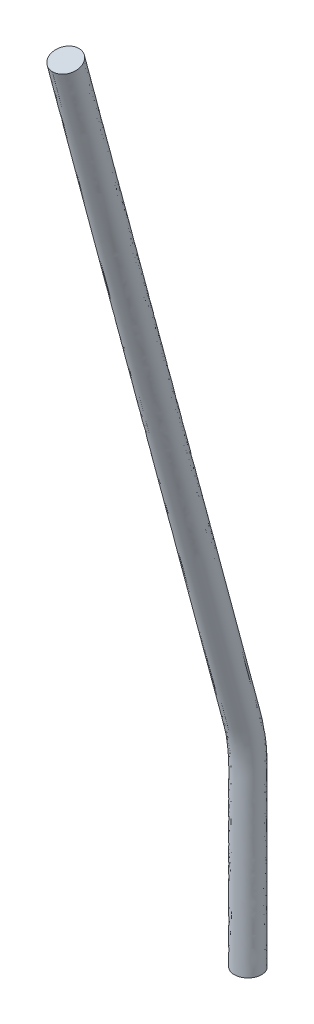
ISO-10303-21;
HEADER;
FILE_DESCRIPTION(('STEP AP214'),'2;1');
FILE_NAME('part.step','',(''),(''),'','','');
FILE_SCHEMA(('AUTOMOTIVE_DESIGN { 1 0 10303 214 1 1 1 1 }'));
ENDSEC;
DATA;
#1=APPLICATION_CONTEXT('core data for automotive mechanical design processes');
#2=APPLICATION_PROTOCOL_DEFINITION('international standard','automotive_design',2000,#1);
#3=PRODUCT_CONTEXT('',#1,'mechanical');
#4=PRODUCT('Part','Part','',(#3));
#5=PRODUCT_RELATED_PRODUCT_CATEGORY('part','',(#4));
#6=PRODUCT_DEFINITION_FORMATION('','',#4);
#7=PRODUCT_DEFINITION_CONTEXT('part definition',#1,'design');
#8=PRODUCT_DEFINITION('design','',#6,#7);
#9=PRODUCT_DEFINITION_SHAPE('','',#8);
#10=(LENGTH_UNIT() NAMED_UNIT(*) SI_UNIT(.MILLI.,.METRE.));
#11=(NAMED_UNIT(*) PLANE_ANGLE_UNIT() SI_UNIT($,.RADIAN.));
#12=(NAMED_UNIT(*) SI_UNIT($,.STERADIAN.) SOLID_ANGLE_UNIT());
#13=UNCERTAINTY_MEASURE_WITH_UNIT(LENGTH_MEASURE(1.E-05),#10,'distance_accuracy_value','');
#14=(GEOMETRIC_REPRESENTATION_CONTEXT(3) GLOBAL_UNCERTAINTY_ASSIGNED_CONTEXT((#13)) GLOBAL_UNIT_ASSIGNED_CONTEXT((#10,
#11,#12)) REPRESENTATION_CONTEXT('',''));
#15=CARTESIAN_POINT('',(0.,0.,0.));
#16=DIRECTION('',(0.,0.,1.));
#17=DIRECTION('',(1.,0.,0.));
#18=AXIS2_PLACEMENT_3D('',#15,#16,#17);
#19=CARTESIAN_POINT('',(0.,4.44089209850063E-13,0.450000000000061));
#20=DIRECTION('',(0.,1.,0.));
#21=DIRECTION('',(0.,0.,1.));
#22=AXIS2_PLACEMENT_3D('',#19,#20,#21);
#23=PLANE('',#22);
#24=CARTESIAN_POINT('',(0.,4.44089209850063E-13,0.450000000000061));
#25=DIRECTION('',(0.,1.,0.));
#26=DIRECTION('',(0.,0.,1.));
#27=AXIS2_PLACEMENT_3D('',#24,#25,#26);
#28=CIRCLE('',#27,20.);
#29=CARTESIAN_POINT('',(0.,4.47419878923938E-13,20.4500000000001));
#30=VERTEX_POINT('',#29);
#31=EDGE_CURVE('E37',#30,#30,#28,.T.);
#32=ORIENTED_EDGE('',*,*,#31,.F.);
#33=EDGE_LOOP('',(#32));
#34=FACE_BOUND('',#33,.T.);
#35=ADVANCED_FACE('F31',(#34),#23,.F.);
#36=CARTESIAN_POINT('',(0.,1282.58353142975,267.113851051514));
#37=DIRECTION('',(0.,0.965925826289082,0.25881904510247));
#38=DIRECTION('',(0.,-0.25881904510247,0.965925826289082));
#39=AXIS2_PLACEMENT_3D('',#36,#37,#38);
#40=PLANE('',#39);
#41=CARTESIAN_POINT('',(0.,1282.58353142975,267.113851051514));
#42=DIRECTION('',(0.,0.965925826289082,0.25881904510247));
#43=DIRECTION('',(0.,-0.25881904510247,0.965925826289082));
#44=AXIS2_PLACEMENT_3D('',#41,#42,#43);
#45=CIRCLE('',#44,20.);
#46=CARTESIAN_POINT('',(0.,1277.4071505277,286.432367577295));
#47=VERTEX_POINT('',#46);
#48=EDGE_CURVE('E10',#47,#47,#45,.T.);
#49=ORIENTED_EDGE('',*,*,#48,.T.);
#50=EDGE_LOOP('',(#49));
#51=FACE_BOUND('',#50,.T.);
#52=ADVANCED_FACE('F46',(#51),#40,.T.);
#53=CARTESIAN_POINT('',(0.,4.44089209850063E-13,20.45));
#54=CARTESIAN_POINT('',(0.,42.3333333251512,20.45));
#55=CARTESIAN_POINT('',(0.,84.6666666698091,20.45));
#56=CARTESIAN_POINT('',(0.,148.166666665096,20.45));
#57=CARTESIAN_POINT('',(0.,169.333333332942,20.45));
#58=CARTESIAN_POINT('',(0.,201.08333333353,20.45));
#59=CARTESIAN_POINT('',(0.,211.666666667646,20.45));
#60=CARTESIAN_POINT('',(0.,227.541666666178,20.45));
#61=CARTESIAN_POINT('',(0.,232.833333333823,20.45));
#62=CARTESIAN_POINT('',(0.,240.770833333089,20.45));
#63=CARTESIAN_POINT('',(0.,243.416666666912,20.45));
#64=CARTESIAN_POINT('',(0.,247.385416666545,20.45));
#65=CARTESIAN_POINT('',(0.,248.708333333456,20.45));
#66=CARTESIAN_POINT('',(0.,250.692708333273,20.45));
#67=CARTESIAN_POINT('',(0.,251.354166666728,20.45));
#68=CARTESIAN_POINT('',(0.,252.346354166637,20.45));
#69=CARTESIAN_POINT('',(0.,252.677083333328,20.45));
#70=CARTESIAN_POINT('',(0.,253.338541666673,20.45));
#71=CARTESIAN_POINT('',(0.,253.68231477618,20.4499997002845));
#72=CARTESIAN_POINT('',(0.,254.332089796174,20.4500003133053));
#73=CARTESIAN_POINT('',(0.,254.636908435247,20.4506513380733));
#74=CARTESIAN_POINT('',(0.,255.273810518115,20.4532566711152));
#75=CARTESIAN_POINT('',(0.,255.592258577074,20.4552106660872));
#76=CARTESIAN_POINT('',(0.,256.547586007731,20.4630265779422));
#77=CARTESIAN_POINT('',(0.,257.184448637491,20.4708424318978));
#78=CARTESIAN_POINT('',(0.,259.094906972576,20.5021049059399));
#79=CARTESIAN_POINT('',(0.,260.368373193236,20.5333666042336));
#80=CARTESIAN_POINT('',(0.,264.187750514645,20.6583993702841));
#81=CARTESIAN_POINT('',(0.,266.732641010395,20.7834208838223));
#82=CARTESIAN_POINT('',(0.,274.359169005351,21.283287183115));
#83=CARTESIAN_POINT('',(0.,279.432662975103,21.7829798576069));
#84=CARTESIAN_POINT('',(0.,289.536121411057,23.113125394701));
#85=CARTESIAN_POINT('',(0.,294.566070247085,23.9435761997898));
#86=CARTESIAN_POINT('',(0.,302.062105520137,25.434633125123));
#87=CARTESIAN_POINT('',(0.,304.552638924694,25.972537744131));
#88=CARTESIAN_POINT('',(0.,308.274234979802,26.8402929576237));
#89=CARTESIAN_POINT('',(0.,309.512400014169,27.1396937870391));
#90=CARTESIAN_POINT('',(0.,311.365852384268,27.6039595579431));
#91=CARTESIAN_POINT('',(0.,311.983037337882,27.7612422005129));
#92=CARTESIAN_POINT('',(0.,312.907835682493,28.0009495426749));
#93=CARTESIAN_POINT('',(0.,313.215938618173,28.0814825510158));
#94=CARTESIAN_POINT('',(0.,313.831813098511,28.2438083814847));
#95=CARTESIAN_POINT('',(0.,314.126413789211,28.3220724085426));
#96=CARTESIAN_POINT('',(0.,314.748288605588,28.4887026317708));
#97=CARTESIAN_POINT('',(0.,315.074115042836,28.5760078693942));
#98=CARTESIAN_POINT('',(0.,315.701042101764,28.7439924685393));
#99=CARTESIAN_POINT('',(0.,316.01450563124,28.8279847681226));
#100=CARTESIAN_POINT('',(0.,316.954896219686,29.0799616668672));
#101=CARTESIAN_POINT('',(0.,317.581823278565,29.2479462659978));
#102=CARTESIAN_POINT('',(0.,319.462604455565,29.7519000635409));
#103=CARTESIAN_POINT('',(0.,320.716458573397,30.0878692618023));
#104=CARTESIAN_POINT('',(0.,324.478020926964,31.0957768567805));
#105=CARTESIAN_POINT('',(0.,326.985729162822,31.7677152534227));
#106=CARTESIAN_POINT('',(0.,334.508853870233,33.7835304432366));
#107=CARTESIAN_POINT('',(0.,339.524270341766,35.1274072365439));
#108=CARTESIAN_POINT('',(0.,354.570519756588,39.1590376163879));
#109=CARTESIAN_POINT('',(0.,364.60135270023,41.8467912028584));
#110=CARTESIAN_POINT('',(0.,394.693851528143,49.9100519625463));
#111=CARTESIAN_POINT('',(0.,414.755517415427,55.2855591354873));
#112=CARTESIAN_POINT('',(0.,474.940515074713,71.4120806548632));
#113=CARTESIAN_POINT('',(0.,515.063846846977,82.1630950013218));
#114=CARTESIAN_POINT('',(0.,635.433842165548,114.416138038344));
#115=CARTESIAN_POINT('',(0.,715.680505710073,135.918166731261));
#116=CARTESIAN_POINT('',(0.,956.420496347217,200.424252808765));
#117=CARTESIAN_POINT('',(0.,1116.91382346394,243.428310185375));
#118=CARTESIAN_POINT('',(0.,1277.4071505277,286.432367577295));
#119=CARTESIAN_POINT('',(40.,4.44089209850063E-13,20.45));
#120=CARTESIAN_POINT('',(40.,42.3333333251512,20.45));
#121=CARTESIAN_POINT('',(40.,84.6666666698091,20.45));
#122=CARTESIAN_POINT('',(40.,148.166666665096,20.45));
#123=CARTESIAN_POINT('',(40.,169.333333332942,20.45));
#124=CARTESIAN_POINT('',(40.,201.08333333353,20.45));
#125=CARTESIAN_POINT('',(40.,211.666666667646,20.45));
#126=CARTESIAN_POINT('',(40.,227.541666666178,20.45));
#127=CARTESIAN_POINT('',(40.,232.833333333823,20.45));
#128=CARTESIAN_POINT('',(40.,240.770833333089,20.45));
#129=CARTESIAN_POINT('',(40.,243.416666666912,20.45));
#130=CARTESIAN_POINT('',(40.,247.385416666545,20.45));
#131=CARTESIAN_POINT('',(40.,248.708333333456,20.45));
#132=CARTESIAN_POINT('',(40.,250.692708333273,20.45));
#133=CARTESIAN_POINT('',(40.,251.354166666728,20.45));
#134=CARTESIAN_POINT('',(40.,252.346354166637,20.45));
#135=CARTESIAN_POINT('',(40.,252.677083333328,20.45));
#136=CARTESIAN_POINT('',(40.,253.338541666673,20.45));
#137=CARTESIAN_POINT('',(40.,253.68231477618,20.4499997002845));
#138=CARTESIAN_POINT('',(40.,254.332089796174,20.4500003133053));
#139=CARTESIAN_POINT('',(40.,254.636908435247,20.4506513380733));
#140=CARTESIAN_POINT('',(40.,255.273810518115,20.4532566711152));
#141=CARTESIAN_POINT('',(40.,255.592258577074,20.4552106660872));
#142=CARTESIAN_POINT('',(40.,256.547586007731,20.4630265779422));
#143=CARTESIAN_POINT('',(40.,257.184448637491,20.4708424318978));
#144=CARTESIAN_POINT('',(40.,259.094906972576,20.5021049059399));
#145=CARTESIAN_POINT('',(40.,260.368373193236,20.5333666042336));
#146=CARTESIAN_POINT('',(40.,264.187750514645,20.6583993702841));
#147=CARTESIAN_POINT('',(40.,266.732641010395,20.7834208838223));
#148=CARTESIAN_POINT('',(40.,274.359169005351,21.283287183115));
#149=CARTESIAN_POINT('',(40.,279.432662975103,21.7829798576069));
#150=CARTESIAN_POINT('',(40.,289.536121411057,23.113125394701));
#151=CARTESIAN_POINT('',(40.,294.566070247085,23.9435761997898));
#152=CARTESIAN_POINT('',(40.,302.062105520137,25.434633125123));
#153=CARTESIAN_POINT('',(40.,304.552638924694,25.972537744131));
#154=CARTESIAN_POINT('',(40.,308.274234979802,26.8402929576237));
#155=CARTESIAN_POINT('',(40.,309.512400014169,27.1396937870391));
#156=CARTESIAN_POINT('',(40.,311.365852384268,27.6039595579431));
#157=CARTESIAN_POINT('',(40.,311.983037337882,27.7612422005129));
#158=CARTESIAN_POINT('',(40.,312.907835682493,28.0009495426749));
#159=CARTESIAN_POINT('',(40.,313.215938618173,28.0814825510158));
#160=CARTESIAN_POINT('',(40.,313.831813098511,28.2438083814847));
#161=CARTESIAN_POINT('',(40.,314.126413789211,28.3220724085426));
#162=CARTESIAN_POINT('',(40.,314.748288605588,28.4887026317708));
#163=CARTESIAN_POINT('',(40.,315.074115042836,28.5760078693942));
#164=CARTESIAN_POINT('',(40.,315.701042101764,28.7439924685393));
#165=CARTESIAN_POINT('',(40.,316.01450563124,28.8279847681226));
#166=CARTESIAN_POINT('',(40.,316.954896219686,29.0799616668672));
#167=CARTESIAN_POINT('',(40.,317.581823278565,29.2479462659978));
#168=CARTESIAN_POINT('',(40.,319.462604455565,29.7519000635409));
#169=CARTESIAN_POINT('',(40.,320.716458573397,30.0878692618023));
#170=CARTESIAN_POINT('',(40.,324.478020926964,31.0957768567805));
#171=CARTESIAN_POINT('',(40.,326.985729162822,31.7677152534227));
#172=CARTESIAN_POINT('',(40.,334.508853870233,33.7835304432366));
#173=CARTESIAN_POINT('',(40.,339.524270341766,35.1274072365439));
#174=CARTESIAN_POINT('',(40.,354.570519756588,39.1590376163879));
#175=CARTESIAN_POINT('',(40.,364.60135270023,41.8467912028584));
#176=CARTESIAN_POINT('',(40.,394.693851528143,49.9100519625463));
#177=CARTESIAN_POINT('',(40.,414.755517415427,55.2855591354873));
#178=CARTESIAN_POINT('',(40.,474.940515074713,71.4120806548632));
#179=CARTESIAN_POINT('',(40.,515.063846846977,82.1630950013218));
#180=CARTESIAN_POINT('',(40.,635.433842165548,114.416138038344));
#181=CARTESIAN_POINT('',(40.,715.680505710073,135.918166731261));
#182=CARTESIAN_POINT('',(40.,956.420496347217,200.424252808765));
#183=CARTESIAN_POINT('',(40.,1116.91382346394,243.428310185375));
#184=CARTESIAN_POINT('',(40.,1277.4071505277,286.432367577295));
#185=CARTESIAN_POINT('',(40.,2.22044604925031E-13,-19.5499999999999));
#186=CARTESIAN_POINT('',(40.,42.333333325151,-19.5499999999999));
#187=CARTESIAN_POINT('',(40.,84.6666666698089,-19.5499999999999));
#188=CARTESIAN_POINT('',(40.,148.166666665096,-19.5499999999999));
#189=CARTESIAN_POINT('',(40.,169.333333332942,-19.5499999999999));
#190=CARTESIAN_POINT('',(40.,201.08333333353,-19.5499999999999));
#191=CARTESIAN_POINT('',(40.,211.666666667646,-19.5499999999999));
#192=CARTESIAN_POINT('',(40.,227.541666666177,-19.5499999999999));
#193=CARTESIAN_POINT('',(40.,232.833333333823,-19.5499999999999));
#194=CARTESIAN_POINT('',(40.,240.770833333089,-19.5499999999999));
#195=CARTESIAN_POINT('',(40.,243.416666666912,-19.5499999999999));
#196=CARTESIAN_POINT('',(40.,247.385416666545,-19.5499999999999));
#197=CARTESIAN_POINT('',(40.,248.708333333456,-19.5499999999999));
#198=CARTESIAN_POINT('',(40.,250.692708333272,-19.5499999999999));
#199=CARTESIAN_POINT('',(40.,251.354166666728,-19.5499999999999));
#200=CARTESIAN_POINT('',(40.,252.346354166636,-19.5499999999999));
#201=CARTESIAN_POINT('',(40.,252.677083333327,-19.5499999999999));
#202=CARTESIAN_POINT('',(40.,253.338541666673,-19.5499999999999));
#203=CARTESIAN_POINT('',(40.,253.656226890879,-19.5500003511486));
#204=CARTESIAN_POINT('',(40.,254.359360565674,-19.5499996329293));
#205=CARTESIAN_POINT('',(40.,254.745991447096,-19.5492371075602));
#206=CARTESIAN_POINT('',(40.,255.491975453749,-19.5461855603317));
#207=CARTESIAN_POINT('',(40.,255.864963963869,-19.5438969055459));
#208=CARTESIAN_POINT('',(40.,256.98390987972,-19.5347423661171));
#209=CARTESIAN_POINT('',(40.,257.729847676097,-19.525587894475));
#210=CARTESIAN_POINT('',(40.,259.967509323117,-19.4889711110213));
#211=CARTESIAN_POINT('',(40.,261.459081511491,-19.4523552361664));
#212=CARTESIAN_POINT('',(40.,265.932601812386,-19.3059081664257));
#213=CARTESIAN_POINT('',(40.,268.913354520831,-19.1594742762696));
#214=CARTESIAN_POINT('',(40.,277.846074423123,-18.5739961082152));
#215=CARTESIAN_POINT('',(40.,283.788503347814,-17.988721301591));
#216=CARTESIAN_POINT('',(40.,295.62237641598,-16.430762356002));
#217=CARTESIAN_POINT('',(40.,301.51380225219,-15.4580806272326));
#218=CARTESIAN_POINT('',(40.,310.29368000462,-13.711651075363));
#219=CARTESIAN_POINT('',(40.,313.210765907886,-13.0816197819959));
#220=CARTESIAN_POINT('',(40.,317.569757990821,-12.0652445362695));
#221=CARTESIAN_POINT('',(40.,319.019982975239,-11.7145654659227));
#222=CARTESIAN_POINT('',(40.,321.190875271765,-11.170785112049));
#223=CARTESIAN_POINT('',(40.,321.913765205742,-10.9865647443797));
#224=CARTESIAN_POINT('',(40.,322.996953333051,-10.705802837084));
#225=CARTESIAN_POINT('',(40.,323.357824915504,-10.6114769778106));
#226=CARTESIAN_POINT('',(40.,324.079179931846,-10.4213496777843));
#227=CARTESIAN_POINT('',(40.,324.45283404414,-10.3220187841901));
#228=CARTESIAN_POINT('',(40.,325.125776391243,-10.1417051652469));
#229=CARTESIAN_POINT('',(40.,325.426876846935,-10.0610251821691));
#230=CARTESIAN_POINT('',(40.,326.053803905863,-9.89304058302404));
#231=CARTESIAN_POINT('',(40.,326.367267435339,-9.80904828344065));
#232=CARTESIAN_POINT('',(40.,327.307658023785,-9.55707138469611));
#233=CARTESIAN_POINT('',(40.,327.934585082664,-9.38908678556549));
#234=CARTESIAN_POINT('',(40.,329.815366259664,-8.88513298802235));
#235=CARTESIAN_POINT('',(40.,331.069220377495,-8.549163789761));
#236=CARTESIAN_POINT('',(40.,334.830782731063,-7.54125619478282));
#237=CARTESIAN_POINT('',(40.,337.338490966921,-6.86931779814061));
#238=CARTESIAN_POINT('',(40.,344.861615674332,-4.85350260832671));
#239=CARTESIAN_POINT('',(40.,349.877032145865,-3.50962581501937));
#240=CARTESIAN_POINT('',(40.,364.923281560686,0.522004564824595));
#241=CARTESIAN_POINT('',(40.,374.954114504328,3.20975815129507));
#242=CARTESIAN_POINT('',(40.,405.046613332242,11.273018910983));
#243=CARTESIAN_POINT('',(40.,425.108279219526,16.648526083924));
#244=CARTESIAN_POINT('',(40.,485.293276878812,32.7750476032999));
#245=CARTESIAN_POINT('',(40.,525.416608651075,43.5260619497585));
#246=CARTESIAN_POINT('',(40.,645.786603969647,75.7791049867808));
#247=CARTESIAN_POINT('',(40.,726.033267514172,97.2811336796978));
#248=CARTESIAN_POINT('',(40.,966.773258151315,161.787219757201));
#249=CARTESIAN_POINT('',(40.,1127.26658526804,204.791277133812));
#250=CARTESIAN_POINT('',(40.,1287.7599123318,247.795334525732));
#251=CARTESIAN_POINT('',(0.,2.22044604925031E-13,-19.5499999999999));
#252=CARTESIAN_POINT('',(0.,42.333333325151,-19.5499999999999));
#253=CARTESIAN_POINT('',(0.,84.6666666698089,-19.5499999999999));
#254=CARTESIAN_POINT('',(0.,148.166666665096,-19.5499999999999));
#255=CARTESIAN_POINT('',(0.,169.333333332942,-19.5499999999999));
#256=CARTESIAN_POINT('',(0.,201.08333333353,-19.5499999999999));
#257=CARTESIAN_POINT('',(0.,211.666666667646,-19.5499999999999));
#258=CARTESIAN_POINT('',(0.,227.541666666177,-19.5499999999999));
#259=CARTESIAN_POINT('',(0.,232.833333333823,-19.5499999999999));
#260=CARTESIAN_POINT('',(0.,240.770833333089,-19.5499999999999));
#261=CARTESIAN_POINT('',(0.,243.416666666912,-19.5499999999999));
#262=CARTESIAN_POINT('',(0.,247.385416666545,-19.5499999999999));
#263=CARTESIAN_POINT('',(0.,248.708333333456,-19.5499999999999));
#264=CARTESIAN_POINT('',(0.,250.692708333272,-19.5499999999999));
#265=CARTESIAN_POINT('',(0.,251.354166666728,-19.5499999999999));
#266=CARTESIAN_POINT('',(0.,252.346354166636,-19.5499999999999));
#267=CARTESIAN_POINT('',(0.,252.677083333327,-19.5499999999999));
#268=CARTESIAN_POINT('',(0.,253.338541666673,-19.5499999999999));
#269=CARTESIAN_POINT('',(0.,253.656226890879,-19.5500003511486));
#270=CARTESIAN_POINT('',(0.,254.359360565674,-19.5499996329293));
#271=CARTESIAN_POINT('',(0.,254.745991447096,-19.5492371075602));
#272=CARTESIAN_POINT('',(0.,255.491975453749,-19.5461855603317));
#273=CARTESIAN_POINT('',(0.,255.864963963869,-19.5438969055459));
#274=CARTESIAN_POINT('',(0.,256.98390987972,-19.5347423661171));
#275=CARTESIAN_POINT('',(0.,257.729847676097,-19.525587894475));
#276=CARTESIAN_POINT('',(0.,259.967509323117,-19.4889711110213));
#277=CARTESIAN_POINT('',(0.,261.459081511491,-19.4523552361664));
#278=CARTESIAN_POINT('',(0.,265.932601812386,-19.3059081664257));
#279=CARTESIAN_POINT('',(0.,268.913354520831,-19.1594742762696));
#280=CARTESIAN_POINT('',(0.,277.846074423123,-18.5739961082152));
#281=CARTESIAN_POINT('',(0.,283.788503347814,-17.988721301591));
#282=CARTESIAN_POINT('',(0.,295.62237641598,-16.430762356002));
#283=CARTESIAN_POINT('',(0.,301.51380225219,-15.4580806272326));
#284=CARTESIAN_POINT('',(0.,310.29368000462,-13.711651075363));
#285=CARTESIAN_POINT('',(0.,313.210765907886,-13.0816197819959));
#286=CARTESIAN_POINT('',(0.,317.569757990821,-12.0652445362695));
#287=CARTESIAN_POINT('',(0.,319.019982975239,-11.7145654659227));
#288=CARTESIAN_POINT('',(0.,321.190875271765,-11.170785112049));
#289=CARTESIAN_POINT('',(0.,321.913765205742,-10.9865647443797));
#290=CARTESIAN_POINT('',(0.,322.996953333051,-10.705802837084));
#291=CARTESIAN_POINT('',(0.,323.357824915504,-10.6114769778106));
#292=CARTESIAN_POINT('',(0.,324.079179931846,-10.4213496777843));
#293=CARTESIAN_POINT('',(0.,324.45283404414,-10.3220187841901));
#294=CARTESIAN_POINT('',(0.,325.125776391243,-10.1417051652469));
#295=CARTESIAN_POINT('',(0.,325.426876846935,-10.0610251821691));
#296=CARTESIAN_POINT('',(0.,326.053803905863,-9.89304058302404));
#297=CARTESIAN_POINT('',(0.,326.367267435339,-9.80904828344065));
#298=CARTESIAN_POINT('',(0.,327.307658023785,-9.55707138469611));
#299=CARTESIAN_POINT('',(0.,327.934585082664,-9.38908678556549));
#300=CARTESIAN_POINT('',(0.,329.815366259664,-8.88513298802235));
#301=CARTESIAN_POINT('',(0.,331.069220377495,-8.549163789761));
#302=CARTESIAN_POINT('',(0.,334.830782731063,-7.54125619478282));
#303=CARTESIAN_POINT('',(0.,337.338490966921,-6.8693177981406));
#304=CARTESIAN_POINT('',(0.,344.861615674332,-4.85350260832671));
#305=CARTESIAN_POINT('',(0.,349.877032145865,-3.50962581501937));
#306=CARTESIAN_POINT('',(0.,364.923281560686,0.522004564824595));
#307=CARTESIAN_POINT('',(0.,374.954114504328,3.20975815129507));
#308=CARTESIAN_POINT('',(0.,405.046613332242,11.273018910983));
#309=CARTESIAN_POINT('',(0.,425.108279219526,16.648526083924));
#310=CARTESIAN_POINT('',(0.,485.293276878812,32.7750476032999));
#311=CARTESIAN_POINT('',(0.,525.416608651075,43.5260619497585));
#312=CARTESIAN_POINT('',(0.,645.786603969647,75.7791049867808));
#313=CARTESIAN_POINT('',(0.,726.033267514172,97.2811336796978));
#314=CARTESIAN_POINT('',(0.,966.773258151315,161.787219757201));
#315=CARTESIAN_POINT('',(0.,1127.26658526804,204.791277133812));
#316=CARTESIAN_POINT('',(0.,1287.7599123318,247.795334525732));
#317=CARTESIAN_POINT('',(-40.,2.22044604925031E-13,-19.5499999999999));
#318=CARTESIAN_POINT('',(-40.,42.333333325151,-19.5499999999999));
#319=CARTESIAN_POINT('',(-40.,84.6666666698089,-19.5499999999999));
#320=CARTESIAN_POINT('',(-40.,148.166666665096,-19.5499999999999));
#321=CARTESIAN_POINT('',(-40.,169.333333332942,-19.5499999999999));
#322=CARTESIAN_POINT('',(-40.,201.08333333353,-19.5499999999999));
#323=CARTESIAN_POINT('',(-40.,211.666666667646,-19.5499999999999));
#324=CARTESIAN_POINT('',(-40.,227.541666666177,-19.5499999999999));
#325=CARTESIAN_POINT('',(-40.,232.833333333823,-19.5499999999999));
#326=CARTESIAN_POINT('',(-40.,240.770833333089,-19.5499999999999));
#327=CARTESIAN_POINT('',(-40.,243.416666666912,-19.5499999999999));
#328=CARTESIAN_POINT('',(-40.,247.385416666545,-19.5499999999999));
#329=CARTESIAN_POINT('',(-40.,248.708333333456,-19.5499999999999));
#330=CARTESIAN_POINT('',(-40.,250.692708333272,-19.5499999999999));
#331=CARTESIAN_POINT('',(-40.,251.354166666728,-19.5499999999999));
#332=CARTESIAN_POINT('',(-40.,252.346354166636,-19.5499999999999));
#333=CARTESIAN_POINT('',(-40.,252.677083333327,-19.5499999999999));
#334=CARTESIAN_POINT('',(-40.,253.338541666673,-19.5499999999999));
#335=CARTESIAN_POINT('',(-40.,253.656226890879,-19.5500003511486));
#336=CARTESIAN_POINT('',(-40.,254.359360565674,-19.5499996329293));
#337=CARTESIAN_POINT('',(-40.,254.745991447096,-19.5492371075602));
#338=CARTESIAN_POINT('',(-40.,255.491975453749,-19.5461855603317));
#339=CARTESIAN_POINT('',(-40.,255.864963963869,-19.5438969055459));
#340=CARTESIAN_POINT('',(-40.,256.98390987972,-19.5347423661171));
#341=CARTESIAN_POINT('',(-40.,257.729847676097,-19.525587894475));
#342=CARTESIAN_POINT('',(-40.,259.967509323117,-19.4889711110213));
#343=CARTESIAN_POINT('',(-40.,261.459081511491,-19.4523552361664));
#344=CARTESIAN_POINT('',(-40.,265.932601812386,-19.3059081664257));
#345=CARTESIAN_POINT('',(-40.,268.913354520831,-19.1594742762696));
#346=CARTESIAN_POINT('',(-40.,277.846074423123,-18.5739961082152));
#347=CARTESIAN_POINT('',(-40.,283.788503347814,-17.988721301591));
#348=CARTESIAN_POINT('',(-40.,295.62237641598,-16.430762356002));
#349=CARTESIAN_POINT('',(-40.,301.51380225219,-15.4580806272326));
#350=CARTESIAN_POINT('',(-40.,310.29368000462,-13.711651075363));
#351=CARTESIAN_POINT('',(-40.,313.210765907886,-13.0816197819959));
#352=CARTESIAN_POINT('',(-40.,317.569757990821,-12.0652445362695));
#353=CARTESIAN_POINT('',(-40.,319.019982975239,-11.7145654659227));
#354=CARTESIAN_POINT('',(-40.,321.190875271765,-11.170785112049));
#355=CARTESIAN_POINT('',(-40.,321.913765205742,-10.9865647443797));
#356=CARTESIAN_POINT('',(-40.,322.996953333051,-10.705802837084));
#357=CARTESIAN_POINT('',(-40.,323.357824915504,-10.6114769778106));
#358=CARTESIAN_POINT('',(-40.,324.079179931846,-10.4213496777843));
#359=CARTESIAN_POINT('',(-40.,324.45283404414,-10.3220187841901));
#360=CARTESIAN_POINT('',(-40.,325.125776391243,-10.1417051652469));
#361=CARTESIAN_POINT('',(-40.,325.426876846935,-10.0610251821691));
#362=CARTESIAN_POINT('',(-40.,326.053803905863,-9.89304058302404));
#363=CARTESIAN_POINT('',(-40.,326.367267435339,-9.80904828344065));
#364=CARTESIAN_POINT('',(-40.,327.307658023785,-9.55707138469611));
#365=CARTESIAN_POINT('',(-40.,327.934585082664,-9.38908678556549));
#366=CARTESIAN_POINT('',(-40.,329.815366259664,-8.88513298802235));
#367=CARTESIAN_POINT('',(-40.,331.069220377495,-8.549163789761));
#368=CARTESIAN_POINT('',(-40.,334.830782731063,-7.54125619478282));
#369=CARTESIAN_POINT('',(-40.,337.338490966921,-6.86931779814061));
#370=CARTESIAN_POINT('',(-40.,344.861615674332,-4.85350260832671));
#371=CARTESIAN_POINT('',(-40.,349.877032145865,-3.50962581501937));
#372=CARTESIAN_POINT('',(-40.,364.923281560686,0.522004564824595));
#373=CARTESIAN_POINT('',(-40.,374.954114504328,3.20975815129507));
#374=CARTESIAN_POINT('',(-40.,405.046613332242,11.273018910983));
#375=CARTESIAN_POINT('',(-40.,425.108279219526,16.648526083924));
#376=CARTESIAN_POINT('',(-40.,485.293276878812,32.7750476032999));
#377=CARTESIAN_POINT('',(-40.,525.416608651075,43.5260619497585));
#378=CARTESIAN_POINT('',(-40.,645.786603969647,75.7791049867808));
#379=CARTESIAN_POINT('',(-40.,726.033267514172,97.2811336796978));
#380=CARTESIAN_POINT('',(-40.,966.773258151315,161.787219757201));
#381=CARTESIAN_POINT('',(-40.,1127.26658526804,204.791277133812));
#382=CARTESIAN_POINT('',(-40.,1287.7599123318,247.795334525732));
#383=CARTESIAN_POINT('',(-40.,4.44089209850063E-13,20.45));
#384=CARTESIAN_POINT('',(-40.,42.3333333251512,20.45));
#385=CARTESIAN_POINT('',(-40.,84.6666666698091,20.45));
#386=CARTESIAN_POINT('',(-40.,148.166666665096,20.45));
#387=CARTESIAN_POINT('',(-40.,169.333333332942,20.45));
#388=CARTESIAN_POINT('',(-40.,201.08333333353,20.45));
#389=CARTESIAN_POINT('',(-40.,211.666666667646,20.45));
#390=CARTESIAN_POINT('',(-40.,227.541666666178,20.45));
#391=CARTESIAN_POINT('',(-40.,232.833333333823,20.45));
#392=CARTESIAN_POINT('',(-40.,240.770833333089,20.45));
#393=CARTESIAN_POINT('',(-40.,243.416666666912,20.45));
#394=CARTESIAN_POINT('',(-40.,247.385416666545,20.45));
#395=CARTESIAN_POINT('',(-40.,248.708333333456,20.45));
#396=CARTESIAN_POINT('',(-40.,250.692708333273,20.45));
#397=CARTESIAN_POINT('',(-40.,251.354166666728,20.45));
#398=CARTESIAN_POINT('',(-40.,252.346354166637,20.45));
#399=CARTESIAN_POINT('',(-40.,252.677083333328,20.45));
#400=CARTESIAN_POINT('',(-40.,253.338541666673,20.45));
#401=CARTESIAN_POINT('',(-40.,253.68231477618,20.4499997002845));
#402=CARTESIAN_POINT('',(-40.,254.332089796174,20.4500003133053));
#403=CARTESIAN_POINT('',(-40.,254.636908435247,20.4506513380733));
#404=CARTESIAN_POINT('',(-40.,255.273810518115,20.4532566711152));
#405=CARTESIAN_POINT('',(-40.,255.592258577074,20.4552106660872));
#406=CARTESIAN_POINT('',(-40.,256.547586007731,20.4630265779422));
#407=CARTESIAN_POINT('',(-40.,257.184448637491,20.4708424318978));
#408=CARTESIAN_POINT('',(-40.,259.094906972576,20.5021049059399));
#409=CARTESIAN_POINT('',(-40.,260.368373193236,20.5333666042336));
#410=CARTESIAN_POINT('',(-40.,264.187750514645,20.6583993702841));
#411=CARTESIAN_POINT('',(-40.,266.732641010395,20.7834208838223));
#412=CARTESIAN_POINT('',(-40.,274.359169005351,21.283287183115));
#413=CARTESIAN_POINT('',(-40.,279.432662975103,21.7829798576069));
#414=CARTESIAN_POINT('',(-40.,289.536121411057,23.113125394701));
#415=CARTESIAN_POINT('',(-40.,294.566070247085,23.9435761997898));
#416=CARTESIAN_POINT('',(-40.,302.062105520137,25.434633125123));
#417=CARTESIAN_POINT('',(-40.,304.552638924694,25.972537744131));
#418=CARTESIAN_POINT('',(-40.,308.274234979802,26.8402929576237));
#419=CARTESIAN_POINT('',(-40.,309.512400014169,27.1396937870391));
#420=CARTESIAN_POINT('',(-40.,311.365852384268,27.6039595579431));
#421=CARTESIAN_POINT('',(-40.,311.983037337882,27.7612422005129));
#422=CARTESIAN_POINT('',(-40.,312.907835682493,28.0009495426749));
#423=CARTESIAN_POINT('',(-40.,313.215938618173,28.0814825510158));
#424=CARTESIAN_POINT('',(-40.,313.831813098511,28.2438083814847));
#425=CARTESIAN_POINT('',(-40.,314.126413789211,28.3220724085426));
#426=CARTESIAN_POINT('',(-40.,314.748288605588,28.4887026317708));
#427=CARTESIAN_POINT('',(-40.,315.074115042836,28.5760078693942));
#428=CARTESIAN_POINT('',(-40.,315.701042101764,28.7439924685393));
#429=CARTESIAN_POINT('',(-40.,316.01450563124,28.8279847681226));
#430=CARTESIAN_POINT('',(-40.,316.954896219686,29.0799616668672));
#431=CARTESIAN_POINT('',(-40.,317.581823278565,29.2479462659978));
#432=CARTESIAN_POINT('',(-40.,319.462604455565,29.7519000635409));
#433=CARTESIAN_POINT('',(-40.,320.716458573397,30.0878692618023));
#434=CARTESIAN_POINT('',(-40.,324.478020926964,31.0957768567805));
#435=CARTESIAN_POINT('',(-40.,326.985729162822,31.7677152534227));
#436=CARTESIAN_POINT('',(-40.,334.508853870233,33.7835304432366));
#437=CARTESIAN_POINT('',(-40.,339.524270341766,35.1274072365439));
#438=CARTESIAN_POINT('',(-40.,354.570519756588,39.1590376163879));
#439=CARTESIAN_POINT('',(-40.,364.60135270023,41.8467912028584));
#440=CARTESIAN_POINT('',(-40.,394.693851528143,49.9100519625463));
#441=CARTESIAN_POINT('',(-40.,414.755517415427,55.2855591354873));
#442=CARTESIAN_POINT('',(-40.,474.940515074713,71.4120806548632));
#443=CARTESIAN_POINT('',(-40.,515.063846846977,82.1630950013218));
#444=CARTESIAN_POINT('',(-40.,635.433842165548,114.416138038344));
#445=CARTESIAN_POINT('',(-40.,715.680505710073,135.918166731261));
#446=CARTESIAN_POINT('',(-40.,956.420496347217,200.424252808765));
#447=CARTESIAN_POINT('',(-40.,1116.91382346394,243.428310185375));
#448=CARTESIAN_POINT('',(-40.,1277.4071505277,286.432367577295));
#449=CARTESIAN_POINT('',(0.,4.44089209850063E-13,20.45));
#450=CARTESIAN_POINT('',(0.,42.3333333251512,20.45));
#451=CARTESIAN_POINT('',(0.,84.6666666698091,20.45));
#452=CARTESIAN_POINT('',(0.,148.166666665096,20.45));
#453=CARTESIAN_POINT('',(0.,169.333333332942,20.45));
#454=CARTESIAN_POINT('',(0.,201.08333333353,20.45));
#455=CARTESIAN_POINT('',(0.,211.666666667646,20.45));
#456=CARTESIAN_POINT('',(0.,227.541666666178,20.45));
#457=CARTESIAN_POINT('',(0.,232.833333333823,20.45));
#458=CARTESIAN_POINT('',(0.,240.770833333089,20.45));
#459=CARTESIAN_POINT('',(0.,243.416666666912,20.45));
#460=CARTESIAN_POINT('',(0.,247.385416666545,20.45));
#461=CARTESIAN_POINT('',(0.,248.708333333456,20.45));
#462=CARTESIAN_POINT('',(0.,250.692708333273,20.45));
#463=CARTESIAN_POINT('',(0.,251.354166666728,20.45));
#464=CARTESIAN_POINT('',(0.,252.346354166637,20.45));
#465=CARTESIAN_POINT('',(0.,252.677083333328,20.45));
#466=CARTESIAN_POINT('',(0.,253.338541666673,20.45));
#467=CARTESIAN_POINT('',(0.,253.68231477618,20.4499997002845));
#468=CARTESIAN_POINT('',(0.,254.332089796174,20.4500003133053));
#469=CARTESIAN_POINT('',(0.,254.636908435247,20.4506513380733));
#470=CARTESIAN_POINT('',(0.,255.273810518115,20.4532566711152));
#471=CARTESIAN_POINT('',(0.,255.592258577074,20.4552106660872));
#472=CARTESIAN_POINT('',(0.,256.547586007731,20.4630265779422));
#473=CARTESIAN_POINT('',(0.,257.184448637491,20.4708424318978));
#474=CARTESIAN_POINT('',(0.,259.094906972576,20.5021049059399));
#475=CARTESIAN_POINT('',(0.,260.368373193236,20.5333666042336));
#476=CARTESIAN_POINT('',(0.,264.187750514645,20.6583993702841));
#477=CARTESIAN_POINT('',(0.,266.732641010395,20.7834208838223));
#478=CARTESIAN_POINT('',(0.,274.359169005351,21.283287183115));
#479=CARTESIAN_POINT('',(0.,279.432662975103,21.7829798576069));
#480=CARTESIAN_POINT('',(0.,289.536121411057,23.113125394701));
#481=CARTESIAN_POINT('',(0.,294.566070247085,23.9435761997898));
#482=CARTESIAN_POINT('',(0.,302.062105520137,25.434633125123));
#483=CARTESIAN_POINT('',(0.,304.552638924694,25.972537744131));
#484=CARTESIAN_POINT('',(0.,308.274234979802,26.8402929576237));
#485=CARTESIAN_POINT('',(0.,309.512400014169,27.1396937870391));
#486=CARTESIAN_POINT('',(0.,311.365852384268,27.6039595579431));
#487=CARTESIAN_POINT('',(0.,311.983037337882,27.7612422005129));
#488=CARTESIAN_POINT('',(0.,312.907835682493,28.0009495426749));
#489=CARTESIAN_POINT('',(0.,313.215938618173,28.0814825510158));
#490=CARTESIAN_POINT('',(0.,313.831813098511,28.2438083814847));
#491=CARTESIAN_POINT('',(0.,314.126413789211,28.3220724085426));
#492=CARTESIAN_POINT('',(0.,314.748288605588,28.4887026317708));
#493=CARTESIAN_POINT('',(0.,315.074115042836,28.5760078693942));
#494=CARTESIAN_POINT('',(0.,315.701042101764,28.7439924685393));
#495=CARTESIAN_POINT('',(0.,316.01450563124,28.8279847681226));
#496=CARTESIAN_POINT('',(0.,316.954896219686,29.0799616668672));
#497=CARTESIAN_POINT('',(0.,317.581823278565,29.2479462659978));
#498=CARTESIAN_POINT('',(0.,319.462604455565,29.7519000635409));
#499=CARTESIAN_POINT('',(0.,320.716458573397,30.0878692618023));
#500=CARTESIAN_POINT('',(0.,324.478020926964,31.0957768567805));
#501=CARTESIAN_POINT('',(0.,326.985729162822,31.7677152534227));
#502=CARTESIAN_POINT('',(0.,334.508853870233,33.7835304432366));
#503=CARTESIAN_POINT('',(0.,339.524270341766,35.1274072365439));
#504=CARTESIAN_POINT('',(0.,354.570519756588,39.1590376163879));
#505=CARTESIAN_POINT('',(0.,364.60135270023,41.8467912028584));
#506=CARTESIAN_POINT('',(0.,394.693851528143,49.9100519625463));
#507=CARTESIAN_POINT('',(0.,414.755517415427,55.2855591354873));
#508=CARTESIAN_POINT('',(0.,474.940515074713,71.4120806548632));
#509=CARTESIAN_POINT('',(0.,515.063846846977,82.1630950013218));
#510=CARTESIAN_POINT('',(0.,635.433842165548,114.416138038344));
#511=CARTESIAN_POINT('',(0.,715.680505710073,135.918166731261));
#512=CARTESIAN_POINT('',(0.,956.420496347217,200.424252808765));
#513=CARTESIAN_POINT('',(0.,1116.91382346394,243.428310185375));
#514=CARTESIAN_POINT('',(0.,1277.4071505277,286.432367577295));
#515=(BOUNDED_SURFACE() B_SPLINE_SURFACE(3,3,((#53,#54,#55,#56,#57,#58,#59,#60,#61,#62,#63,#64,
#65,#66,#67,#68,#69,#70,#71,#72,#73,#74,#75,#76,#77,#78,#79,#80,#81,#82,#83,#84,#85,#86,#87,#88,
#89,#90,#91,#92,#93,#94,#95,#96,#97,#98,#99,#100,#101,#102,#103,#104,#105,#106,#107,#108,#109,
#110,#111,#112,#113,#114,#115,#116,#117,#118),(#119,#120,#121,#122,#123,#124,#125,#126,#127,
#128,#129,#130,#131,#132,#133,#134,#135,#136,#137,#138,#139,#140,#141,#142,#143,#144,#145,#146,
#147,#148,#149,#150,#151,#152,#153,#154,#155,#156,#157,#158,#159,#160,#161,#162,#163,#164,#165,
#166,#167,#168,#169,#170,#171,#172,#173,#174,#175,#176,#177,#178,#179,#180,#181,#182,#183,#184),
(#185,#186,#187,#188,#189,#190,#191,#192,#193,#194,#195,#196,#197,#198,#199,#200,#201,#202,#203,
#204,#205,#206,#207,#208,#209,#210,#211,#212,#213,#214,#215,#216,#217,#218,#219,#220,#221,#222,
#223,#224,#225,#226,#227,#228,#229,#230,#231,#232,#233,#234,#235,#236,#237,#238,#239,#240,#241,
#242,#243,#244,#245,#246,#247,#248,#249,#250),(#251,#252,#253,#254,#255,#256,#257,#258,#259,
#260,#261,#262,#263,#264,#265,#266,#267,#268,#269,#270,#271,#272,#273,#274,#275,#276,#277,#278,
#279,#280,#281,#282,#283,#284,#285,#286,#287,#288,#289,#290,#291,#292,#293,#294,#295,#296,#297,
#298,#299,#300,#301,#302,#303,#304,#305,#306,#307,#308,#309,#310,#311,#312,#313,#314,#315,#316),
(#317,#318,#319,#320,#321,#322,#323,#324,#325,#326,#327,#328,#329,#330,#331,#332,#333,#334,#335,
#336,#337,#338,#339,#340,#341,#342,#343,#344,#345,#346,#347,#348,#349,#350,#351,#352,#353,#354,
#355,#356,#357,#358,#359,#360,#361,#362,#363,#364,#365,#366,#367,#368,#369,#370,#371,#372,#373,
#374,#375,#376,#377,#378,#379,#380,#381,#382),(#383,#384,#385,#386,#387,#388,#389,#390,#391,
#392,#393,#394,#395,#396,#397,#398,#399,#400,#401,#402,#403,#404,#405,#406,#407,#408,#409,#410,
#411,#412,#413,#414,#415,#416,#417,#418,#419,#420,#421,#422,#423,#424,#425,#426,#427,#428,#429,
#430,#431,#432,#433,#434,#435,#436,#437,#438,#439,#440,#441,#442,#443,#444,#445,#446,#447,#448),
(#449,#450,#451,#452,#453,#454,#455,#456,#457,#458,#459,#460,#461,#462,#463,#464,#465,#466,#467,
#468,#469,#470,#471,#472,#473,#474,#475,#476,#477,#478,#479,#480,#481,#482,#483,#484,#485,#486,
#487,#488,#489,#490,#491,#492,#493,#494,#495,#496,#497,#498,#499,#500,#501,#502,#503,#504,#505,
#506,#507,#508,#509,#510,#511,#512,#513,#514)),.UNSPECIFIED.,.T.,.F.,
.F.) B_SPLINE_SURFACE_WITH_KNOTS((4,3,4),(4,2,2,2,2,2,2,2,2,2,2,2,2,2,2,2,2,2,2,2,2,2,2,2,2,2,2,
2,2,2,2,2,4),(0.,0.5,1.),(0.,0.0964086819581335,0.1446130229372,0.168715193426734,
0.1807662786715,0.186791821293884,0.189804592605075,0.191310978260671,0.192064171088469,
0.192817363916267,0.193604708224117,0.194392052531968,0.195966741147668,0.19911611837907,
0.205414872841873,0.218012381767478,0.230609890693084,0.236908645155886,0.240058022387288,
0.241632711002988,0.242420055310839,0.243207399618689,0.243946454892499,0.244685510166309,
0.246163620713929,0.249119841809168,0.255032283999647,0.266857168380605,0.290506937142521,
0.337806474666353,0.432405549714017,0.621603699809344,1.),
.UNSPECIFIED.) GEOMETRIC_REPRESENTATION_ITEM() RATIONAL_B_SPLINE_SURFACE(((1.,1.,1.,1.,1.,1.,1.,
1.,1.,1.,1.,1.,1.,1.,1.,1.,1.,1.,1.,1.,1.,1.,1.,1.,1.,1.,1.,1.,1.,1.,1.,1.,1.,1.,1.,1.,1.,1.,1.,
1.,1.,1.,1.,1.,1.,1.,1.,1.,1.,1.,1.,1.,1.,1.,1.,1.,1.,1.,1.,1.,1.,1.,1.,1.,1.,1.),
(0.333333333333333,0.333333333333333,0.333333333333333,0.333333333333333,0.333333333333333,
0.333333333333333,0.333333333333333,0.333333333333333,0.333333333333333,0.333333333333333,
0.333333333333333,0.333333333333333,0.333333333333333,0.333333333333333,0.333333333333333,
0.333333333333333,0.333333333333333,0.333333333333333,0.333333333333333,0.333333333333333,
0.333333333333333,0.333333333333333,0.333333333333333,0.333333333333333,0.333333333333333,
0.333333333333333,0.333333333333333,0.333333333333333,0.333333333333333,0.333333333333333,
0.333333333333333,0.333333333333333,0.333333333333333,0.333333333333333,0.333333333333333,
0.333333333333333,0.333333333333333,0.333333333333333,0.333333333333333,0.333333333333333,
0.333333333333333,0.333333333333333,0.333333333333333,0.333333333333333,0.333333333333333,
0.333333333333333,0.333333333333333,0.333333333333333,0.333333333333333,0.333333333333333,
0.333333333333333,0.333333333333333,0.333333333333333,0.333333333333333,0.333333333333333,
0.333333333333333,0.333333333333333,0.333333333333333,0.333333333333333,0.333333333333333,
0.333333333333333,0.333333333333333,0.333333333333333,0.333333333333333,0.333333333333333,
0.333333333333333),(0.333333333333333,0.333333333333333,0.333333333333333,0.333333333333333,
0.333333333333333,0.333333333333333,0.333333333333333,0.333333333333333,0.333333333333333,
0.333333333333333,0.333333333333333,0.333333333333333,0.333333333333333,0.333333333333333,
0.333333333333333,0.333333333333333,0.333333333333333,0.333333333333333,0.333333333333333,
0.333333333333333,0.333333333333333,0.333333333333333,0.333333333333333,0.333333333333333,
0.333333333333333,0.333333333333333,0.333333333333333,0.333333333333333,0.333333333333333,
0.333333333333333,0.333333333333333,0.333333333333333,0.333333333333333,0.333333333333333,
0.333333333333333,0.333333333333333,0.333333333333333,0.333333333333333,0.333333333333333,
0.333333333333333,0.333333333333333,0.333333333333333,0.333333333333333,0.333333333333333,
0.333333333333333,0.333333333333333,0.333333333333333,0.333333333333333,0.333333333333333,
0.333333333333333,0.333333333333333,0.333333333333333,0.333333333333333,0.333333333333333,
0.333333333333333,0.333333333333333,0.333333333333333,0.333333333333333,0.333333333333333,
0.333333333333333,0.333333333333333,0.333333333333333,0.333333333333333,0.333333333333333,
0.333333333333333,0.333333333333333),(1.,1.,1.,1.,1.,1.,1.,1.,1.,1.,1.,1.,1.,1.,1.,1.,1.,1.,1.,
1.,1.,1.,1.,1.,1.,1.,1.,1.,1.,1.,1.,1.,1.,1.,1.,1.,1.,1.,1.,1.,1.,1.,1.,1.,1.,1.,1.,1.,1.,1.,1.,
1.,1.,1.,1.,1.,1.,1.,1.,1.,1.,1.,1.,1.,1.,1.),(0.333333333333333,0.333333333333333,
0.333333333333333,0.333333333333333,0.333333333333333,0.333333333333333,0.333333333333333,
0.333333333333333,0.333333333333333,0.333333333333333,0.333333333333333,0.333333333333333,
0.333333333333333,0.333333333333333,0.333333333333333,0.333333333333333,0.333333333333333,
0.333333333333333,0.333333333333333,0.333333333333333,0.333333333333333,0.333333333333333,
0.333333333333333,0.333333333333333,0.333333333333333,0.333333333333333,0.333333333333333,
0.333333333333333,0.333333333333333,0.333333333333333,0.333333333333333,0.333333333333333,
0.333333333333333,0.333333333333333,0.333333333333333,0.333333333333333,0.333333333333333,
0.333333333333333,0.333333333333333,0.333333333333333,0.333333333333333,0.333333333333333,
0.333333333333333,0.333333333333333,0.333333333333333,0.333333333333333,0.333333333333333,
0.333333333333333,0.333333333333333,0.333333333333333,0.333333333333333,0.333333333333333,
0.333333333333333,0.333333333333333,0.333333333333333,0.333333333333333,0.333333333333333,
0.333333333333333,0.333333333333333,0.333333333333333,0.333333333333333,0.333333333333333,
0.333333333333333,0.333333333333333,0.333333333333333,0.333333333333333),(0.333333333333333,
0.333333333333333,0.333333333333333,0.333333333333333,0.333333333333333,0.333333333333333,
0.333333333333333,0.333333333333333,0.333333333333333,0.333333333333333,0.333333333333333,
0.333333333333333,0.333333333333333,0.333333333333333,0.333333333333333,0.333333333333333,
0.333333333333333,0.333333333333333,0.333333333333333,0.333333333333333,0.333333333333333,
0.333333333333333,0.333333333333333,0.333333333333333,0.333333333333333,0.333333333333333,
0.333333333333333,0.333333333333333,0.333333333333333,0.333333333333333,0.333333333333333,
0.333333333333333,0.333333333333333,0.333333333333333,0.333333333333333,0.333333333333333,
0.333333333333333,0.333333333333333,0.333333333333333,0.333333333333333,0.333333333333333,
0.333333333333333,0.333333333333333,0.333333333333333,0.333333333333333,0.333333333333333,
0.333333333333333,0.333333333333333,0.333333333333333,0.333333333333333,0.333333333333333,
0.333333333333333,0.333333333333333,0.333333333333333,0.333333333333333,0.333333333333333,
0.333333333333333,0.333333333333333,0.333333333333333,0.333333333333333,0.333333333333333,
0.333333333333333,0.333333333333333,0.333333333333333,0.333333333333333,0.333333333333333),(1.,
1.,1.,1.,1.,1.,1.,1.,1.,1.,1.,1.,1.,1.,1.,1.,1.,1.,1.,1.,1.,1.,1.,1.,1.,1.,1.,1.,1.,1.,1.,1.,1.,
1.,1.,1.,1.,1.,1.,1.,1.,1.,1.,1.,1.,1.,1.,1.,1.,1.,1.,1.,1.,1.,1.,1.,1.,1.,1.,1.,1.,1.,1.,1.,1.,1.))) REPRESENTATION_ITEM('') SURFACE());
#516=ORIENTED_EDGE('',*,*,#48,.F.);
#517=EDGE_LOOP('',(#516));
#518=FACE_BOUND('',#517,.T.);
#519=ORIENTED_EDGE('',*,*,#31,.T.);
#520=EDGE_LOOP('',(#519));
#521=FACE_BOUND('',#520,.T.);
#522=ADVANCED_FACE('F43',(#518,#521),#515,.T.);
#523=CLOSED_SHELL('',(#35,#52,#522));
#524=MANIFOLD_SOLID_BREP('B2',#523);
#525=ADVANCED_BREP_SHAPE_REPRESENTATION('',(#18,#524),#14);
#526=SHAPE_DEFINITION_REPRESENTATION(#9,#525);
ENDSEC;
END-ISO-10303-21;
